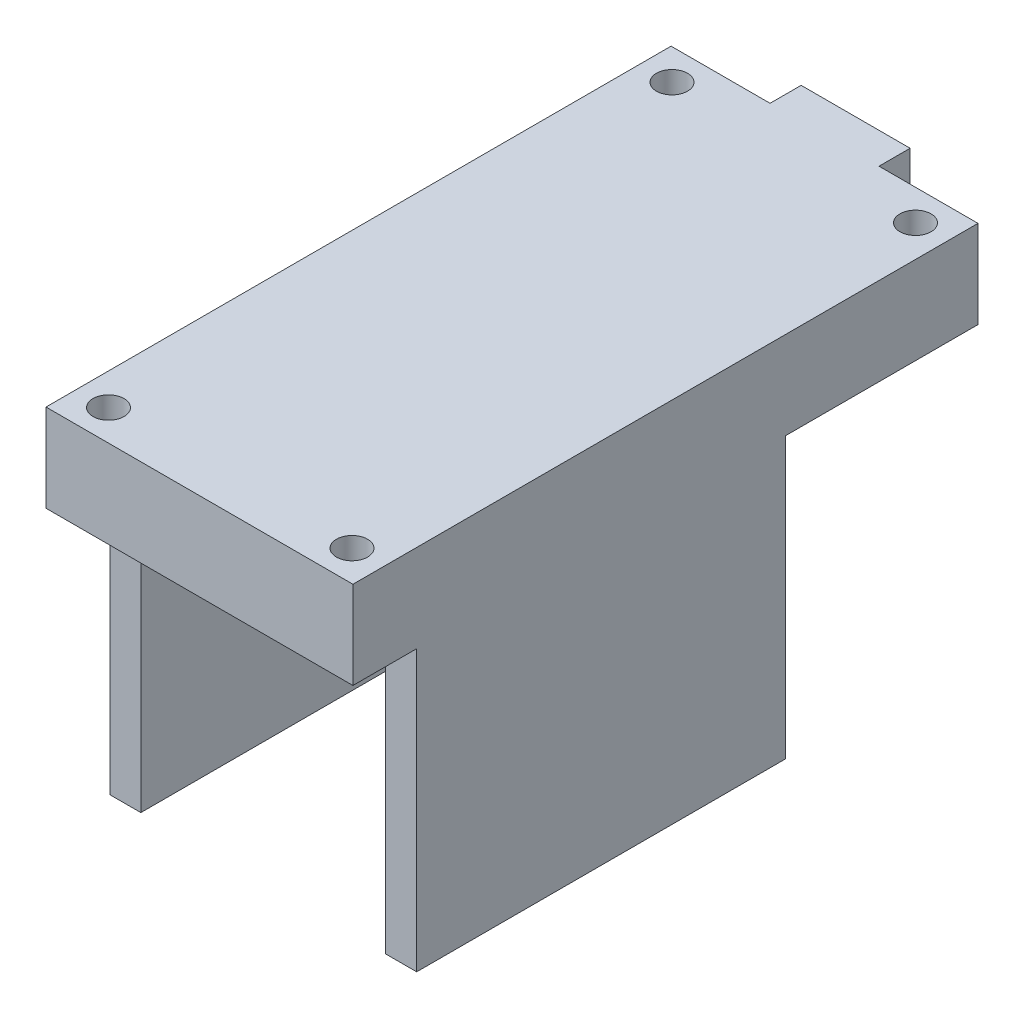
ISO-10303-21;
HEADER;
FILE_DESCRIPTION(('STEP AP214'),'2;1');
FILE_NAME('part.step','',(''),(''),'','','');
FILE_SCHEMA(('AUTOMOTIVE_DESIGN { 1 0 10303 214 1 1 1 1 }'));
ENDSEC;
DATA;
#1=APPLICATION_CONTEXT('core data for automotive mechanical design processes');
#2=APPLICATION_PROTOCOL_DEFINITION('international standard','automotive_design',2000,#1);
#3=PRODUCT_CONTEXT('',#1,'mechanical');
#4=PRODUCT('Part','Part','',(#3));
#5=PRODUCT_RELATED_PRODUCT_CATEGORY('part','',(#4));
#6=PRODUCT_DEFINITION_FORMATION('','',#4);
#7=PRODUCT_DEFINITION_CONTEXT('part definition',#1,'design');
#8=PRODUCT_DEFINITION('design','',#6,#7);
#9=PRODUCT_DEFINITION_SHAPE('','',#8);
#10=(LENGTH_UNIT() NAMED_UNIT(*) SI_UNIT(.MILLI.,.METRE.));
#11=(NAMED_UNIT(*) PLANE_ANGLE_UNIT() SI_UNIT($,.RADIAN.));
#12=(NAMED_UNIT(*) SI_UNIT($,.STERADIAN.) SOLID_ANGLE_UNIT());
#13=UNCERTAINTY_MEASURE_WITH_UNIT(LENGTH_MEASURE(1.E-05),#10,'distance_accuracy_value','');
#14=(GEOMETRIC_REPRESENTATION_CONTEXT(3) GLOBAL_UNCERTAINTY_ASSIGNED_CONTEXT((#13)) GLOBAL_UNIT_ASSIGNED_CONTEXT((#10,
#11,#12)) REPRESENTATION_CONTEXT('',''));
#15=CARTESIAN_POINT('',(0.,0.,0.));
#16=DIRECTION('',(0.,0.,1.));
#17=DIRECTION('',(1.,0.,0.));
#18=AXIS2_PLACEMENT_3D('',#15,#16,#17);
#19=CARTESIAN_POINT('',(-12.5349,7.1628,-25.527));
#20=DIRECTION('',(0.,0.,1.));
#21=DIRECTION('',(1.,0.,0.));
#22=AXIS2_PLACEMENT_3D('',#19,#20,#21);
#23=PLANE('',#22);
#24=DIRECTION('',(0.,-1.,0.));
#25=VECTOR('',#24,1.);
#26=CARTESIAN_POINT('',(4.45,0.,-25.527));
#27=LINE('',#26,#25);
#28=CARTESIAN_POINT('',(4.45,7.1628,-25.527));
#29=VERTEX_POINT('',#28);
#30=CARTESIAN_POINT('',(4.45,0.,-25.527));
#31=VERTEX_POINT('',#30);
#32=EDGE_CURVE('E68',#29,#31,#27,.T.);
#33=ORIENTED_EDGE('',*,*,#32,.F.);
#34=DIRECTION('',(-1.,0.,0.));
#35=VECTOR('',#34,1.);
#36=CARTESIAN_POINT('',(-12.5349,7.1628,-25.527));
#37=LINE('',#36,#35);
#38=CARTESIAN_POINT('',(12.5349,7.1628,-25.527));
#39=VERTEX_POINT('',#38);
#40=EDGE_CURVE('E322',#39,#29,#37,.T.);
#41=ORIENTED_EDGE('',*,*,#40,.F.);
#42=DIRECTION('',(0.,-1.,0.));
#43=VECTOR('',#42,1.);
#44=CARTESIAN_POINT('',(12.5349,7.1628,-25.527));
#45=LINE('',#44,#43);
#46=CARTESIAN_POINT('',(12.5349,0.,-25.527));
#47=VERTEX_POINT('',#46);
#48=EDGE_CURVE('E11',#39,#47,#45,.T.);
#49=ORIENTED_EDGE('',*,*,#48,.T.);
#50=DIRECTION('',(-1.,0.,0.));
#51=VECTOR('',#50,1.);
#52=CARTESIAN_POINT('',(-12.5349,0.,-25.527));
#53=LINE('',#52,#51);
#54=EDGE_CURVE('E336',#47,#31,#53,.T.);
#55=ORIENTED_EDGE('',*,*,#54,.T.);
#56=EDGE_LOOP('',(#33,#41,#49,#55));
#57=FACE_BOUND('',#56,.T.);
#58=ADVANCED_FACE('F44',(#57),#23,.F.);
#59=CARTESIAN_POINT('',(0.,7.1628,0.));
#60=DIRECTION('',(0.,-1.,0.));
#61=DIRECTION('',(0.,0.,-1.));
#62=AXIS2_PLACEMENT_3D('',#59,#60,#61);
#63=PLANE('',#62);
#64=DIRECTION('',(0.,0.,-1.));
#65=VECTOR('',#64,1.);
#66=CARTESIAN_POINT('',(12.5349,7.1628,25.527));
#67=LINE('',#66,#65);
#68=CARTESIAN_POINT('',(12.5349,7.1628,25.527));
#69=VERTEX_POINT('',#68);
#70=EDGE_CURVE('E319',#69,#39,#67,.T.);
#71=ORIENTED_EDGE('',*,*,#70,.T.);
#72=ORIENTED_EDGE('',*,*,#40,.T.);
#73=DIRECTION('',(0.,0.,1.));
#74=VECTOR('',#73,1.);
#75=CARTESIAN_POINT('',(4.45,7.1628,-28.067));
#76=LINE('',#75,#74);
#77=CARTESIAN_POINT('',(4.45,7.1628,-28.067));
#78=VERTEX_POINT('',#77);
#79=EDGE_CURVE('E166',#78,#29,#76,.T.);
#80=ORIENTED_EDGE('',*,*,#79,.F.);
#81=DIRECTION('',(1.,0.,0.));
#82=VECTOR('',#81,1.);
#83=CARTESIAN_POINT('',(0.,7.1628,-28.067));
#84=LINE('',#83,#82);
#85=CARTESIAN_POINT('',(-4.45,7.1628,-28.067));
#86=VERTEX_POINT('',#85);
#87=EDGE_CURVE('E175',#86,#78,#84,.T.);
#88=ORIENTED_EDGE('',*,*,#87,.F.);
#89=DIRECTION('',(0.,0.,1.));
#90=VECTOR('',#89,1.);
#91=CARTESIAN_POINT('',(-4.45,7.1628,-28.067));
#92=LINE('',#91,#90);
#93=CARTESIAN_POINT('',(-4.45,7.1628,-25.527));
#94=VERTEX_POINT('',#93);
#95=EDGE_CURVE('E157',#86,#94,#92,.T.);
#96=ORIENTED_EDGE('',*,*,#95,.T.);
#97=CARTESIAN_POINT('',(-12.5349,7.1628,-25.527));
#98=VERTEX_POINT('',#97);
#99=EDGE_CURVE('E62',#94,#98,#37,.T.);
#100=ORIENTED_EDGE('',*,*,#99,.T.);
#101=DIRECTION('',(0.,0.,1.));
#102=VECTOR('',#101,1.);
#103=CARTESIAN_POINT('',(-12.5349,7.1628,25.527));
#104=LINE('',#103,#102);
#105=CARTESIAN_POINT('',(-12.5349,7.1628,25.527));
#106=VERTEX_POINT('',#105);
#107=EDGE_CURVE('E330',#98,#106,#104,.T.);
#108=ORIENTED_EDGE('',*,*,#107,.T.);
#109=DIRECTION('',(1.,0.,0.));
#110=VECTOR('',#109,1.);
#111=CARTESIAN_POINT('',(-12.5349,7.1628,25.527));
#112=LINE('',#111,#110);
#113=EDGE_CURVE('E329',#106,#69,#112,.T.);
#114=ORIENTED_EDGE('',*,*,#113,.T.);
#115=EDGE_LOOP('',(#71,#72,#80,#88,#96,#100,#108,#114));
#116=FACE_BOUND('',#115,.T.);
#117=CARTESIAN_POINT('',(9.9441,7.1628,-23.0124));
#118=DIRECTION('',(0.,1.,0.));
#119=DIRECTION('',(0.,0.,1.));
#120=AXIS2_PLACEMENT_3D('',#117,#118,#119);
#121=CIRCLE('',#120,1.27);
#122=CARTESIAN_POINT('',(9.9441,7.1628,-21.7424));
#123=VERTEX_POINT('',#122);
#124=EDGE_CURVE('E315',#123,#123,#121,.T.);
#125=ORIENTED_EDGE('',*,*,#124,.F.);
#126=EDGE_LOOP('',(#125));
#127=FACE_BOUND('',#126,.T.);
#128=CARTESIAN_POINT('',(-9.94410000000001,7.1628,-23.0124));
#129=DIRECTION('',(0.,1.,0.));
#130=DIRECTION('',(0.,0.,-1.));
#131=AXIS2_PLACEMENT_3D('',#128,#129,#130);
#132=CIRCLE('',#131,1.27);
#133=CARTESIAN_POINT('',(-9.94410000000001,7.1628,-24.2824));
#134=VERTEX_POINT('',#133);
#135=EDGE_CURVE('E303',#134,#134,#132,.T.);
#136=ORIENTED_EDGE('',*,*,#135,.F.);
#137=EDGE_LOOP('',(#136));
#138=FACE_BOUND('',#137,.T.);
#139=CARTESIAN_POINT('',(9.9441,7.1628,23.0124));
#140=DIRECTION('',(0.,1.,0.));
#141=DIRECTION('',(0.,0.,-1.));
#142=AXIS2_PLACEMENT_3D('',#139,#140,#141);
#143=CIRCLE('',#142,1.27);
#144=CARTESIAN_POINT('',(9.9441,7.1628,21.7424));
#145=VERTEX_POINT('',#144);
#146=EDGE_CURVE('E297',#145,#145,#143,.T.);
#147=ORIENTED_EDGE('',*,*,#146,.F.);
#148=EDGE_LOOP('',(#147));
#149=FACE_BOUND('',#148,.T.);
#150=CARTESIAN_POINT('',(-9.94410000000001,7.1628,23.0124));
#151=DIRECTION('',(0.,1.,0.));
#152=DIRECTION('',(0.,0.,1.));
#153=AXIS2_PLACEMENT_3D('',#150,#151,#152);
#154=CIRCLE('',#153,1.27);
#155=CARTESIAN_POINT('',(-9.94410000000001,7.1628,24.2824));
#156=VERTEX_POINT('',#155);
#157=EDGE_CURVE('E287',#156,#156,#154,.T.);
#158=ORIENTED_EDGE('',*,*,#157,.F.);
#159=EDGE_LOOP('',(#158));
#160=FACE_BOUND('',#159,.T.);
#161=ADVANCED_FACE('F171',(#116,#127,#138,#149,#160),#63,.F.);
#162=CARTESIAN_POINT('',(0.,0.,0.));
#163=DIRECTION('',(0.,-1.,0.));
#164=DIRECTION('',(0.,0.,-1.));
#165=AXIS2_PLACEMENT_3D('',#162,#163,#164);
#166=PLANE('',#165);
#167=DIRECTION('',(-1.,0.,0.));
#168=VECTOR('',#167,1.);
#169=CARTESIAN_POINT('',(-12.5349,0.,20.32));
#170=LINE('',#169,#168);
#171=CARTESIAN_POINT('',(-9.9949,0.,20.32));
#172=VERTEX_POINT('',#171);
#173=CARTESIAN_POINT('',(-12.5349,0.,20.32));
#174=VERTEX_POINT('',#173);
#175=EDGE_CURVE('E211',#172,#174,#170,.T.);
#176=ORIENTED_EDGE('',*,*,#175,.F.);
#177=DIRECTION('',(0.,0.,1.));
#178=VECTOR('',#177,1.);
#179=CARTESIAN_POINT('',(-9.9949,0.,20.32));
#180=LINE('',#179,#178);
#181=CARTESIAN_POINT('',(-9.99489999999999,0.,-20.32));
#182=VERTEX_POINT('',#181);
#183=EDGE_CURVE('E223',#182,#172,#180,.T.);
#184=ORIENTED_EDGE('',*,*,#183,.F.);
#185=DIRECTION('',(1.,0.,0.));
#186=VECTOR('',#185,1.);
#187=CARTESIAN_POINT('',(-12.5349,0.,-20.32));
#188=LINE('',#187,#186);
#189=CARTESIAN_POINT('',(-12.5349,0.,-20.32));
#190=VERTEX_POINT('',#189);
#191=EDGE_CURVE('E222',#190,#182,#188,.T.);
#192=ORIENTED_EDGE('',*,*,#191,.F.);
#193=DIRECTION('',(0.,0.,1.));
#194=VECTOR('',#193,1.);
#195=CARTESIAN_POINT('',(-12.5349,0.,25.527));
#196=LINE('',#195,#194);
#197=CARTESIAN_POINT('',(-12.5349,0.,-25.527));
#198=VERTEX_POINT('',#197);
#199=EDGE_CURVE('E342',#198,#190,#196,.T.);
#200=ORIENTED_EDGE('',*,*,#199,.F.);
#201=CARTESIAN_POINT('',(-4.45,0.,-25.527));
#202=VERTEX_POINT('',#201);
#203=EDGE_CURVE('E339',#202,#198,#53,.T.);
#204=ORIENTED_EDGE('',*,*,#203,.F.);
#205=DIRECTION('',(0.,0.,1.));
#206=VECTOR('',#205,1.);
#207=CARTESIAN_POINT('',(-4.45,0.,-28.067));
#208=LINE('',#207,#206);
#209=CARTESIAN_POINT('',(-4.45,0.,-28.067));
#210=VERTEX_POINT('',#209);
#211=EDGE_CURVE('E194',#210,#202,#208,.T.);
#212=ORIENTED_EDGE('',*,*,#211,.F.);
#213=DIRECTION('',(-1.,0.,0.));
#214=VECTOR('',#213,1.);
#215=CARTESIAN_POINT('',(0.,0.,-28.067));
#216=LINE('',#215,#214);
#217=CARTESIAN_POINT('',(4.45,0.,-28.067));
#218=VERTEX_POINT('',#217);
#219=EDGE_CURVE('E184',#218,#210,#216,.T.);
#220=ORIENTED_EDGE('',*,*,#219,.F.);
#221=DIRECTION('',(0.,0.,1.));
#222=VECTOR('',#221,1.);
#223=CARTESIAN_POINT('',(4.45,0.,-28.067));
#224=LINE('',#223,#222);
#225=EDGE_CURVE('E199',#218,#31,#224,.T.);
#226=ORIENTED_EDGE('',*,*,#225,.T.);
#227=ORIENTED_EDGE('',*,*,#54,.F.);
#228=DIRECTION('',(0.,0.,-1.));
#229=VECTOR('',#228,1.);
#230=CARTESIAN_POINT('',(12.5349,0.,25.527));
#231=LINE('',#230,#229);
#232=CARTESIAN_POINT('',(12.5349,0.,-9.8044));
#233=VERTEX_POINT('',#232);
#234=EDGE_CURVE('E316',#233,#47,#231,.T.);
#235=ORIENTED_EDGE('',*,*,#234,.F.);
#236=DIRECTION('',(1.,0.,0.));
#237=VECTOR('',#236,1.);
#238=CARTESIAN_POINT('',(12.5349,0.,-9.8044));
#239=LINE('',#238,#237);
#240=CARTESIAN_POINT('',(9.9949,0.,-9.8044));
#241=VERTEX_POINT('',#240);
#242=EDGE_CURVE('E264',#241,#233,#239,.T.);
#243=ORIENTED_EDGE('',*,*,#242,.F.);
#244=DIRECTION('',(0.,0.,-1.));
#245=VECTOR('',#244,1.);
#246=CARTESIAN_POINT('',(9.9949,0.,20.32));
#247=LINE('',#246,#245);
#248=CARTESIAN_POINT('',(9.9949,0.,20.32));
#249=VERTEX_POINT('',#248);
#250=EDGE_CURVE('E267',#249,#241,#247,.T.);
#251=ORIENTED_EDGE('',*,*,#250,.F.);
#252=DIRECTION('',(-1.,0.,0.));
#253=VECTOR('',#252,1.);
#254=CARTESIAN_POINT('',(12.5349,0.,20.32));
#255=LINE('',#254,#253);
#256=CARTESIAN_POINT('',(12.5349,0.,20.32));
#257=VERTEX_POINT('',#256);
#258=EDGE_CURVE('E227',#257,#249,#255,.T.);
#259=ORIENTED_EDGE('',*,*,#258,.F.);
#260=CARTESIAN_POINT('',(12.5349,0.,25.527));
#261=VERTEX_POINT('',#260);
#262=EDGE_CURVE('E331',#261,#257,#231,.T.);
#263=ORIENTED_EDGE('',*,*,#262,.F.);
#264=DIRECTION('',(1.,0.,0.));
#265=VECTOR('',#264,1.);
#266=CARTESIAN_POINT('',(-12.5349,0.,25.527));
#267=LINE('',#266,#265);
#268=CARTESIAN_POINT('',(-12.5349,0.,25.527));
#269=VERTEX_POINT('',#268);
#270=EDGE_CURVE('E323',#269,#261,#267,.T.);
#271=ORIENTED_EDGE('',*,*,#270,.F.);
#272=EDGE_CURVE('E345',#174,#269,#196,.T.);
#273=ORIENTED_EDGE('',*,*,#272,.F.);
#274=EDGE_LOOP('',(#176,#184,#192,#200,#204,#212,#220,#226,#227,#235,#243,#251,#259,#263,#271,#273));
#275=FACE_BOUND('',#274,.T.);
#276=CARTESIAN_POINT('',(9.9441,0.,23.0124));
#277=DIRECTION('',(0.,1.,0.));
#278=DIRECTION('',(0.,0.,-1.));
#279=AXIS2_PLACEMENT_3D('',#276,#277,#278);
#280=CIRCLE('',#279,1.27);
#281=CARTESIAN_POINT('',(9.9441,0.,21.7424));
#282=VERTEX_POINT('',#281);
#283=EDGE_CURVE('E295',#282,#282,#280,.T.);
#284=ORIENTED_EDGE('',*,*,#283,.T.);
#285=EDGE_LOOP('',(#284));
#286=FACE_BOUND('',#285,.T.);
#287=CARTESIAN_POINT('',(9.9441,0.,-23.0124));
#288=DIRECTION('',(0.,1.,0.));
#289=DIRECTION('',(0.,0.,1.));
#290=AXIS2_PLACEMENT_3D('',#287,#288,#289);
#291=CIRCLE('',#290,1.27);
#292=CARTESIAN_POINT('',(9.9441,0.,-21.7424));
#293=VERTEX_POINT('',#292);
#294=EDGE_CURVE('E306',#293,#293,#291,.T.);
#295=ORIENTED_EDGE('',*,*,#294,.T.);
#296=EDGE_LOOP('',(#295));
#297=FACE_BOUND('',#296,.T.);
#298=CARTESIAN_POINT('',(-9.94410000000001,0.,-23.0124));
#299=DIRECTION('',(0.,1.,0.));
#300=DIRECTION('',(0.,0.,-1.));
#301=AXIS2_PLACEMENT_3D('',#298,#299,#300);
#302=CIRCLE('',#301,1.27);
#303=CARTESIAN_POINT('',(-9.94410000000001,0.,-24.2824));
#304=VERTEX_POINT('',#303);
#305=EDGE_CURVE('E298',#304,#304,#302,.T.);
#306=ORIENTED_EDGE('',*,*,#305,.T.);
#307=EDGE_LOOP('',(#306));
#308=FACE_BOUND('',#307,.T.);
#309=CARTESIAN_POINT('',(-9.94410000000001,0.,23.0124));
#310=DIRECTION('',(0.,1.,0.));
#311=DIRECTION('',(0.,0.,1.));
#312=AXIS2_PLACEMENT_3D('',#309,#310,#311);
#313=CIRCLE('',#312,1.27);
#314=CARTESIAN_POINT('',(-9.94410000000001,0.,24.2824));
#315=VERTEX_POINT('',#314);
#316=EDGE_CURVE('E247',#315,#315,#313,.T.);
#317=ORIENTED_EDGE('',*,*,#316,.T.);
#318=EDGE_LOOP('',(#317));
#319=FACE_BOUND('',#318,.T.);
#320=ADVANCED_FACE('F364',(#275,#286,#297,#308,#319),#166,.T.);
#321=CARTESIAN_POINT('',(12.5349,7.1628,25.527));
#322=DIRECTION('',(-1.,0.,0.));
#323=DIRECTION('',(0.,0.,1.));
#324=AXIS2_PLACEMENT_3D('',#321,#322,#323);
#325=PLANE('',#324);
#326=ORIENTED_EDGE('',*,*,#262,.T.);
#327=DIRECTION('',(0.,1.,0.));
#328=VECTOR('',#327,1.);
#329=CARTESIAN_POINT('',(12.5349,-22.86,20.32));
#330=LINE('',#329,#328);
#331=CARTESIAN_POINT('',(12.5349,-22.86,20.32));
#332=VERTEX_POINT('',#331);
#333=EDGE_CURVE('E169',#332,#257,#330,.T.);
#334=ORIENTED_EDGE('',*,*,#333,.F.);
#335=DIRECTION('',(0.,0.,1.));
#336=VECTOR('',#335,1.);
#337=CARTESIAN_POINT('',(12.5349,-22.86,20.32));
#338=LINE('',#337,#336);
#339=CARTESIAN_POINT('',(12.5349,-22.86,-9.8044));
#340=VERTEX_POINT('',#339);
#341=EDGE_CURVE('E269',#340,#332,#338,.T.);
#342=ORIENTED_EDGE('',*,*,#341,.F.);
#343=DIRECTION('',(0.,1.,0.));
#344=VECTOR('',#343,1.);
#345=CARTESIAN_POINT('',(12.5349,-22.86,-9.8044));
#346=LINE('',#345,#344);
#347=EDGE_CURVE('E257',#340,#233,#346,.T.);
#348=ORIENTED_EDGE('',*,*,#347,.T.);
#349=ORIENTED_EDGE('',*,*,#234,.T.);
#350=ORIENTED_EDGE('',*,*,#48,.F.);
#351=ORIENTED_EDGE('',*,*,#70,.F.);
#352=DIRECTION('',(0.,-1.,0.));
#353=VECTOR('',#352,1.);
#354=CARTESIAN_POINT('',(12.5349,7.1628,25.527));
#355=LINE('',#354,#353);
#356=EDGE_CURVE('E334',#69,#261,#355,.T.);
#357=ORIENTED_EDGE('',*,*,#356,.T.);
#358=EDGE_LOOP('',(#326,#334,#342,#348,#349,#350,#351,#357));
#359=FACE_BOUND('',#358,.T.);
#360=ADVANCED_FACE('F50',(#359),#325,.F.);
#361=ORIENTED_EDGE('',*,*,#99,.F.);
#362=DIRECTION('',(0.,-1.,0.));
#363=VECTOR('',#362,1.);
#364=CARTESIAN_POINT('',(-4.45,0.,-25.527));
#365=LINE('',#364,#363);
#366=EDGE_CURVE('E164',#94,#202,#365,.T.);
#367=ORIENTED_EDGE('',*,*,#366,.T.);
#368=ORIENTED_EDGE('',*,*,#203,.T.);
#369=DIRECTION('',(0.,-1.,0.));
#370=VECTOR('',#369,1.);
#371=CARTESIAN_POINT('',(-12.5349,7.1628,-25.527));
#372=LINE('',#371,#370);
#373=EDGE_CURVE('E53',#98,#198,#372,.T.);
#374=ORIENTED_EDGE('',*,*,#373,.F.);
#375=EDGE_LOOP('',(#361,#367,#368,#374));
#376=FACE_BOUND('',#375,.T.);
#377=ADVANCED_FACE('F416',(#376),#23,.F.);
#378=CARTESIAN_POINT('',(-12.5349,7.1628,25.527));
#379=DIRECTION('',(1.,0.,0.));
#380=DIRECTION('',(0.,0.,-1.));
#381=AXIS2_PLACEMENT_3D('',#378,#379,#380);
#382=PLANE('',#381);
#383=ORIENTED_EDGE('',*,*,#199,.T.);
#384=DIRECTION('',(0.,1.,0.));
#385=VECTOR('',#384,1.);
#386=CARTESIAN_POINT('',(-12.5349,-22.86,-20.32));
#387=LINE('',#386,#385);
#388=CARTESIAN_POINT('',(-12.5349,-22.86,-20.32));
#389=VERTEX_POINT('',#388);
#390=EDGE_CURVE('E241',#389,#190,#387,.T.);
#391=ORIENTED_EDGE('',*,*,#390,.F.);
#392=DIRECTION('',(0.,0.,-1.));
#393=VECTOR('',#392,1.);
#394=CARTESIAN_POINT('',(-12.5349,-22.86,20.32));
#395=LINE('',#394,#393);
#396=CARTESIAN_POINT('',(-12.5349,-22.86,20.32));
#397=VERTEX_POINT('',#396);
#398=EDGE_CURVE('E206',#397,#389,#395,.T.);
#399=ORIENTED_EDGE('',*,*,#398,.F.);
#400=DIRECTION('',(0.,1.,0.));
#401=VECTOR('',#400,1.);
#402=CARTESIAN_POINT('',(-12.5349,-22.86,20.32));
#403=LINE('',#402,#401);
#404=EDGE_CURVE('E219',#397,#174,#403,.T.);
#405=ORIENTED_EDGE('',*,*,#404,.T.);
#406=ORIENTED_EDGE('',*,*,#272,.T.);
#407=DIRECTION('',(0.,-1.,0.));
#408=VECTOR('',#407,1.);
#409=CARTESIAN_POINT('',(-12.5349,7.1628,25.527));
#410=LINE('',#409,#408);
#411=EDGE_CURVE('E355',#106,#269,#410,.T.);
#412=ORIENTED_EDGE('',*,*,#411,.F.);
#413=ORIENTED_EDGE('',*,*,#107,.F.);
#414=ORIENTED_EDGE('',*,*,#373,.T.);
#415=EDGE_LOOP('',(#383,#391,#399,#405,#406,#412,#413,#414));
#416=FACE_BOUND('',#415,.T.);
#417=ADVANCED_FACE('F359',(#416),#382,.F.);
#418=CARTESIAN_POINT('',(-12.5349,7.1628,25.527));
#419=DIRECTION('',(0.,0.,-1.));
#420=DIRECTION('',(-1.,0.,0.));
#421=AXIS2_PLACEMENT_3D('',#418,#419,#420);
#422=PLANE('',#421);
#423=ORIENTED_EDGE('',*,*,#270,.T.);
#424=ORIENTED_EDGE('',*,*,#356,.F.);
#425=ORIENTED_EDGE('',*,*,#113,.F.);
#426=ORIENTED_EDGE('',*,*,#411,.T.);
#427=EDGE_LOOP('',(#423,#424,#425,#426));
#428=FACE_BOUND('',#427,.T.);
#429=ADVANCED_FACE('F431',(#428),#422,.F.);
#430=CARTESIAN_POINT('',(9.9441,7.1628,-23.0124));
#431=DIRECTION('',(0.,-1.,0.));
#432=DIRECTION('',(0.,0.,-1.));
#433=AXIS2_PLACEMENT_3D('',#430,#431,#432);
#434=CYLINDRICAL_SURFACE('',#433,1.27);
#435=ORIENTED_EDGE('',*,*,#124,.T.);
#436=EDGE_LOOP('',(#435));
#437=FACE_BOUND('',#436,.T.);
#438=ORIENTED_EDGE('',*,*,#294,.F.);
#439=EDGE_LOOP('',(#438));
#440=FACE_BOUND('',#439,.T.);
#441=ADVANCED_FACE('F445',(#437,#440),#434,.F.);
#442=CARTESIAN_POINT('',(-9.94410000000001,7.1628,-23.0124));
#443=DIRECTION('',(0.,-1.,0.));
#444=DIRECTION('',(0.,0.,-1.));
#445=AXIS2_PLACEMENT_3D('',#442,#443,#444);
#446=CYLINDRICAL_SURFACE('',#445,1.27);
#447=ORIENTED_EDGE('',*,*,#135,.T.);
#448=EDGE_LOOP('',(#447));
#449=FACE_BOUND('',#448,.T.);
#450=ORIENTED_EDGE('',*,*,#305,.F.);
#451=EDGE_LOOP('',(#450));
#452=FACE_BOUND('',#451,.T.);
#453=ADVANCED_FACE('F447',(#449,#452),#446,.F.);
#454=CARTESIAN_POINT('',(9.9441,7.1628,23.0124));
#455=DIRECTION('',(0.,-1.,0.));
#456=DIRECTION('',(0.,0.,-1.));
#457=AXIS2_PLACEMENT_3D('',#454,#455,#456);
#458=CYLINDRICAL_SURFACE('',#457,1.27);
#459=ORIENTED_EDGE('',*,*,#146,.T.);
#460=EDGE_LOOP('',(#459));
#461=FACE_BOUND('',#460,.T.);
#462=ORIENTED_EDGE('',*,*,#283,.F.);
#463=EDGE_LOOP('',(#462));
#464=FACE_BOUND('',#463,.T.);
#465=ADVANCED_FACE('F451',(#461,#464),#458,.F.);
#466=CARTESIAN_POINT('',(-9.94410000000001,7.1628,23.0124));
#467=DIRECTION('',(0.,-1.,0.));
#468=DIRECTION('',(0.,0.,-1.));
#469=AXIS2_PLACEMENT_3D('',#466,#467,#468);
#470=CYLINDRICAL_SURFACE('',#469,1.27);
#471=ORIENTED_EDGE('',*,*,#157,.T.);
#472=EDGE_LOOP('',(#471));
#473=FACE_BOUND('',#472,.T.);
#474=ORIENTED_EDGE('',*,*,#316,.F.);
#475=EDGE_LOOP('',(#474));
#476=FACE_BOUND('',#475,.T.);
#477=ADVANCED_FACE('F456',(#473,#476),#470,.F.);
#478=CARTESIAN_POINT('',(12.5349,-22.86,20.32));
#479=DIRECTION('',(0.,0.,-1.));
#480=DIRECTION('',(-1.,0.,0.));
#481=AXIS2_PLACEMENT_3D('',#478,#479,#480);
#482=PLANE('',#481);
#483=ORIENTED_EDGE('',*,*,#258,.T.);
#484=DIRECTION('',(0.,1.,0.));
#485=VECTOR('',#484,1.);
#486=CARTESIAN_POINT('',(9.9949,-22.86,20.32));
#487=LINE('',#486,#485);
#488=CARTESIAN_POINT('',(9.9949,-22.86,20.32));
#489=VERTEX_POINT('',#488);
#490=EDGE_CURVE('E252',#489,#249,#487,.T.);
#491=ORIENTED_EDGE('',*,*,#490,.F.);
#492=DIRECTION('',(-1.,0.,0.));
#493=VECTOR('',#492,1.);
#494=CARTESIAN_POINT('',(12.5349,-22.86,20.32));
#495=LINE('',#494,#493);
#496=EDGE_CURVE('E285',#332,#489,#495,.T.);
#497=ORIENTED_EDGE('',*,*,#496,.F.);
#498=ORIENTED_EDGE('',*,*,#333,.T.);
#499=EDGE_LOOP('',(#483,#491,#497,#498));
#500=FACE_BOUND('',#499,.T.);
#501=ADVANCED_FACE('F398',(#500),#482,.F.);
#502=CARTESIAN_POINT('',(9.9949,-22.86,20.32));
#503=DIRECTION('',(1.,0.,0.));
#504=DIRECTION('',(0.,0.,-1.));
#505=AXIS2_PLACEMENT_3D('',#502,#503,#504);
#506=PLANE('',#505);
#507=ORIENTED_EDGE('',*,*,#250,.T.);
#508=DIRECTION('',(0.,1.,0.));
#509=VECTOR('',#508,1.);
#510=CARTESIAN_POINT('',(9.9949,-22.86,-9.8044));
#511=LINE('',#510,#509);
#512=CARTESIAN_POINT('',(9.9949,-22.86,-9.8044));
#513=VERTEX_POINT('',#512);
#514=EDGE_CURVE('E258',#513,#241,#511,.T.);
#515=ORIENTED_EDGE('',*,*,#514,.F.);
#516=DIRECTION('',(0.,0.,-1.));
#517=VECTOR('',#516,1.);
#518=CARTESIAN_POINT('',(9.9949,-22.86,20.32));
#519=LINE('',#518,#517);
#520=EDGE_CURVE('E276',#489,#513,#519,.T.);
#521=ORIENTED_EDGE('',*,*,#520,.F.);
#522=ORIENTED_EDGE('',*,*,#490,.T.);
#523=EDGE_LOOP('',(#507,#515,#521,#522));
#524=FACE_BOUND('',#523,.T.);
#525=ADVANCED_FACE('F405',(#524),#506,.F.);
#526=CARTESIAN_POINT('',(12.5349,-22.86,-9.8044));
#527=DIRECTION('',(0.,0.,1.));
#528=DIRECTION('',(1.,0.,0.));
#529=AXIS2_PLACEMENT_3D('',#526,#527,#528);
#530=PLANE('',#529);
#531=ORIENTED_EDGE('',*,*,#242,.T.);
#532=ORIENTED_EDGE('',*,*,#347,.F.);
#533=DIRECTION('',(1.,0.,0.));
#534=VECTOR('',#533,1.);
#535=CARTESIAN_POINT('',(12.5349,-22.86,-9.8044));
#536=LINE('',#535,#534);
#537=EDGE_CURVE('E262',#513,#340,#536,.T.);
#538=ORIENTED_EDGE('',*,*,#537,.F.);
#539=ORIENTED_EDGE('',*,*,#514,.T.);
#540=EDGE_LOOP('',(#531,#532,#538,#539));
#541=FACE_BOUND('',#540,.T.);
#542=ADVANCED_FACE('F409',(#541),#530,.F.);
#543=CARTESIAN_POINT('',(0.,-22.86,0.));
#544=DIRECTION('',(0.,1.,0.));
#545=DIRECTION('',(0.,0.,1.));
#546=AXIS2_PLACEMENT_3D('',#543,#544,#545);
#547=PLANE('',#546);
#548=ORIENTED_EDGE('',*,*,#341,.T.);
#549=ORIENTED_EDGE('',*,*,#496,.T.);
#550=ORIENTED_EDGE('',*,*,#520,.T.);
#551=ORIENTED_EDGE('',*,*,#537,.T.);
#552=EDGE_LOOP('',(#548,#549,#550,#551));
#553=FACE_BOUND('',#552,.T.);
#554=ADVANCED_FACE('F407',(#553),#547,.F.);
#555=CARTESIAN_POINT('',(-12.5349,-22.86,-20.32));
#556=DIRECTION('',(0.,0.,1.));
#557=DIRECTION('',(1.,0.,0.));
#558=AXIS2_PLACEMENT_3D('',#555,#556,#557);
#559=PLANE('',#558);
#560=ORIENTED_EDGE('',*,*,#191,.T.);
#561=DIRECTION('',(0.,1.,0.));
#562=VECTOR('',#561,1.);
#563=CARTESIAN_POINT('',(-9.99489999999999,-22.86,-20.32));
#564=LINE('',#563,#562);
#565=CARTESIAN_POINT('',(-9.99489999999999,-22.86,-20.32));
#566=VERTEX_POINT('',#565);
#567=EDGE_CURVE('E238',#566,#182,#564,.T.);
#568=ORIENTED_EDGE('',*,*,#567,.F.);
#569=DIRECTION('',(1.,0.,0.));
#570=VECTOR('',#569,1.);
#571=CARTESIAN_POINT('',(-12.5349,-22.86,-20.32));
#572=LINE('',#571,#570);
#573=EDGE_CURVE('E209',#389,#566,#572,.T.);
#574=ORIENTED_EDGE('',*,*,#573,.F.);
#575=ORIENTED_EDGE('',*,*,#390,.T.);
#576=EDGE_LOOP('',(#560,#568,#574,#575));
#577=FACE_BOUND('',#576,.T.);
#578=ADVANCED_FACE('F369',(#577),#559,.F.);
#579=CARTESIAN_POINT('',(-9.9949,-22.86,20.32));
#580=DIRECTION('',(-1.,0.,0.));
#581=DIRECTION('',(0.,0.,1.));
#582=AXIS2_PLACEMENT_3D('',#579,#580,#581);
#583=PLANE('',#582);
#584=ORIENTED_EDGE('',*,*,#183,.T.);
#585=DIRECTION('',(0.,1.,0.));
#586=VECTOR('',#585,1.);
#587=CARTESIAN_POINT('',(-9.9949,-22.86,20.32));
#588=LINE('',#587,#586);
#589=CARTESIAN_POINT('',(-9.9949,-22.86,20.32));
#590=VERTEX_POINT('',#589);
#591=EDGE_CURVE('E237',#590,#172,#588,.T.);
#592=ORIENTED_EDGE('',*,*,#591,.F.);
#593=DIRECTION('',(0.,0.,1.));
#594=VECTOR('',#593,1.);
#595=CARTESIAN_POINT('',(-9.9949,-22.86,20.32));
#596=LINE('',#595,#594);
#597=EDGE_CURVE('E212',#566,#590,#596,.T.);
#598=ORIENTED_EDGE('',*,*,#597,.F.);
#599=ORIENTED_EDGE('',*,*,#567,.T.);
#600=EDGE_LOOP('',(#584,#592,#598,#599));
#601=FACE_BOUND('',#600,.T.);
#602=ADVANCED_FACE('F375',(#601),#583,.F.);
#603=CARTESIAN_POINT('',(-12.5349,-22.86,20.32));
#604=DIRECTION('',(0.,0.,-1.));
#605=DIRECTION('',(-1.,0.,0.));
#606=AXIS2_PLACEMENT_3D('',#603,#604,#605);
#607=PLANE('',#606);
#608=ORIENTED_EDGE('',*,*,#175,.T.);
#609=ORIENTED_EDGE('',*,*,#404,.F.);
#610=DIRECTION('',(-1.,0.,0.));
#611=VECTOR('',#610,1.);
#612=CARTESIAN_POINT('',(-12.5349,-22.86,20.32));
#613=LINE('',#612,#611);
#614=EDGE_CURVE('E220',#590,#397,#613,.T.);
#615=ORIENTED_EDGE('',*,*,#614,.F.);
#616=ORIENTED_EDGE('',*,*,#591,.T.);
#617=EDGE_LOOP('',(#608,#609,#615,#616));
#618=FACE_BOUND('',#617,.T.);
#619=ADVANCED_FACE('F379',(#618),#607,.F.);
#620=CARTESIAN_POINT('',(0.,-22.86,0.));
#621=DIRECTION('',(0.,-1.,0.));
#622=DIRECTION('',(0.,0.,-1.));
#623=AXIS2_PLACEMENT_3D('',#620,#621,#622);
#624=PLANE('',#623);
#625=ORIENTED_EDGE('',*,*,#398,.T.);
#626=ORIENTED_EDGE('',*,*,#573,.T.);
#627=ORIENTED_EDGE('',*,*,#597,.T.);
#628=ORIENTED_EDGE('',*,*,#614,.T.);
#629=EDGE_LOOP('',(#625,#626,#627,#628));
#630=FACE_BOUND('',#629,.T.);
#631=ADVANCED_FACE('F376',(#630),#624,.T.);
#632=CARTESIAN_POINT('',(-4.45,0.,-28.067));
#633=DIRECTION('',(-1.,0.,0.));
#634=DIRECTION('',(0.,-1.,0.));
#635=AXIS2_PLACEMENT_3D('',#632,#633,#634);
#636=PLANE('',#635);
#637=ORIENTED_EDGE('',*,*,#366,.F.);
#638=ORIENTED_EDGE('',*,*,#95,.F.);
#639=DIRECTION('',(0.,-1.,0.));
#640=VECTOR('',#639,1.);
#641=CARTESIAN_POINT('',(-4.45,0.,-28.067));
#642=LINE('',#641,#640);
#643=EDGE_CURVE('E163',#86,#210,#642,.T.);
#644=ORIENTED_EDGE('',*,*,#643,.T.);
#645=ORIENTED_EDGE('',*,*,#211,.T.);
#646=EDGE_LOOP('',(#637,#638,#644,#645));
#647=FACE_BOUND('',#646,.T.);
#648=ADVANCED_FACE('F161',(#647),#636,.T.);
#649=CARTESIAN_POINT('',(4.45,0.,-28.067));
#650=DIRECTION('',(-1.,0.,0.));
#651=DIRECTION('',(0.,-1.,0.));
#652=AXIS2_PLACEMENT_3D('',#649,#650,#651);
#653=PLANE('',#652);
#654=ORIENTED_EDGE('',*,*,#32,.T.);
#655=ORIENTED_EDGE('',*,*,#225,.F.);
#656=DIRECTION('',(0.,-1.,0.));
#657=VECTOR('',#656,1.);
#658=CARTESIAN_POINT('',(4.45,0.,-28.067));
#659=LINE('',#658,#657);
#660=EDGE_CURVE('E179',#78,#218,#659,.T.);
#661=ORIENTED_EDGE('',*,*,#660,.F.);
#662=ORIENTED_EDGE('',*,*,#79,.T.);
#663=EDGE_LOOP('',(#654,#655,#661,#662));
#664=FACE_BOUND('',#663,.T.);
#665=ADVANCED_FACE('F481',(#664),#653,.F.);
#666=CARTESIAN_POINT('',(0.,0.,-28.067));
#667=DIRECTION('',(0.,0.,-1.));
#668=DIRECTION('',(-1.,0.,0.));
#669=AXIS2_PLACEMENT_3D('',#666,#667,#668);
#670=PLANE('',#669);
#671=ORIENTED_EDGE('',*,*,#643,.F.);
#672=ORIENTED_EDGE('',*,*,#87,.T.);
#673=ORIENTED_EDGE('',*,*,#660,.T.);
#674=ORIENTED_EDGE('',*,*,#219,.T.);
#675=EDGE_LOOP('',(#671,#672,#673,#674));
#676=FACE_BOUND('',#675,.T.);
#677=ADVANCED_FACE('F185',(#676),#670,.T.);
#678=CLOSED_SHELL('',(#58,#161,#320,#360,#377,#417,#429,#441,#453,#465,#477,#501,#525,#542,#554,
#578,#602,#619,#631,#648,#665,#677));
#679=MANIFOLD_SOLID_BREP('B2',#678);
#680=ADVANCED_BREP_SHAPE_REPRESENTATION('',(#18,#679),#14);
#681=SHAPE_DEFINITION_REPRESENTATION(#9,#680);
ENDSEC;
END-ISO-10303-21;
